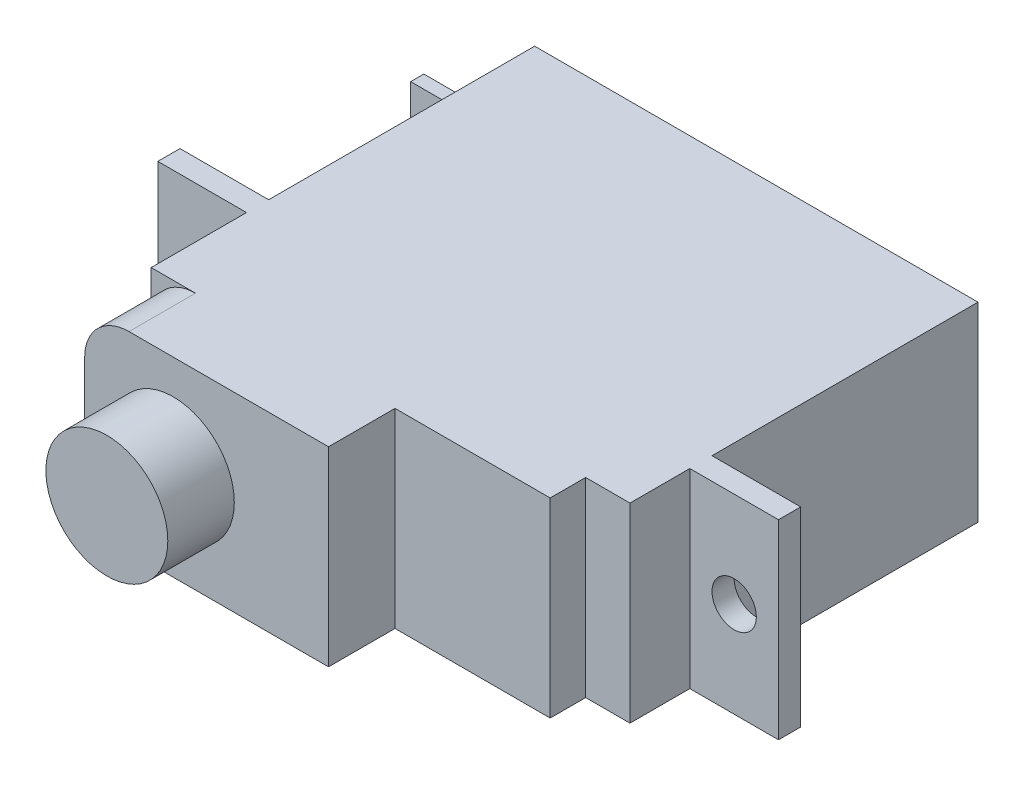
ISO-10303-21;
HEADER;
FILE_DESCRIPTION(('STEP AP214'),'2;1');
FILE_NAME('part.step','',(''),(''),'','','');
FILE_SCHEMA(('AUTOMOTIVE_DESIGN { 1 0 10303 214 1 1 1 1 }'));
ENDSEC;
DATA;
#1=APPLICATION_CONTEXT('core data for automotive mechanical design processes');
#2=APPLICATION_PROTOCOL_DEFINITION('international standard','automotive_design',2000,#1);
#3=PRODUCT_CONTEXT('',#1,'mechanical');
#4=PRODUCT('Part','Part','',(#3));
#5=PRODUCT_RELATED_PRODUCT_CATEGORY('part','',(#4));
#6=PRODUCT_DEFINITION_FORMATION('','',#4);
#7=PRODUCT_DEFINITION_CONTEXT('part definition',#1,'design');
#8=PRODUCT_DEFINITION('design','',#6,#7);
#9=PRODUCT_DEFINITION_SHAPE('','',#8);
#10=(LENGTH_UNIT() NAMED_UNIT(*) SI_UNIT(.MILLI.,.METRE.));
#11=(NAMED_UNIT(*) PLANE_ANGLE_UNIT() SI_UNIT($,.RADIAN.));
#12=(NAMED_UNIT(*) SI_UNIT($,.STERADIAN.) SOLID_ANGLE_UNIT());
#13=UNCERTAINTY_MEASURE_WITH_UNIT(LENGTH_MEASURE(1.E-05),#10,'distance_accuracy_value','');
#14=(GEOMETRIC_REPRESENTATION_CONTEXT(3) GLOBAL_UNCERTAINTY_ASSIGNED_CONTEXT((#13)) GLOBAL_UNIT_ASSIGNED_CONTEXT((#10,
#11,#12)) REPRESENTATION_CONTEXT('',''));
#15=CARTESIAN_POINT('',(0.,0.,0.));
#16=DIRECTION('',(0.,0.,1.));
#17=DIRECTION('',(1.,0.,0.));
#18=AXIS2_PLACEMENT_3D('',#15,#16,#17);
#19=CARTESIAN_POINT('',(-10.,4.3,12.));
#20=DIRECTION('',(1.,0.,0.));
#21=DIRECTION('',(0.,1.,0.));
#22=AXIS2_PLACEMENT_3D('',#19,#20,#21);
#23=PLANE('',#22);
#24=DIRECTION('',(0.,0.,1.));
#25=VECTOR('',#24,1.);
#26=CARTESIAN_POINT('',(-10.,-1.48782817677585,0.593912784888743));
#27=LINE('',#26,#25);
#28=CARTESIAN_POINT('',(-10.,-1.48782817677585,0.));
#29=VERTEX_POINT('',#28);
#30=CARTESIAN_POINT('',(-10.,-1.48782817677585,0.593912784888743));
#31=VERTEX_POINT('',#30);
#32=EDGE_CURVE('E394',#29,#31,#27,.T.);
#33=ORIENTED_EDGE('',*,*,#32,.F.);
#34=DIRECTION('',(0.,-1.,0.));
#35=VECTOR('',#34,1.);
#36=CARTESIAN_POINT('',(-10.,4.3,0.));
#37=LINE('',#36,#35);
#38=CARTESIAN_POINT('',(-10.,-4.3,0.));
#39=VERTEX_POINT('',#38);
#40=EDGE_CURVE('E217',#29,#39,#37,.T.);
#41=ORIENTED_EDGE('',*,*,#40,.T.);
#42=DIRECTION('',(0.,0.,-1.));
#43=VECTOR('',#42,1.);
#44=CARTESIAN_POINT('',(-10.,-4.3,12.));
#45=LINE('',#44,#43);
#46=CARTESIAN_POINT('',(-10.,-4.3,12.));
#47=VERTEX_POINT('',#46);
#48=EDGE_CURVE('E377',#47,#39,#45,.T.);
#49=ORIENTED_EDGE('',*,*,#48,.F.);
#50=DIRECTION('',(0.,-1.,0.));
#51=VECTOR('',#50,1.);
#52=CARTESIAN_POINT('',(-10.,4.3,12.));
#53=LINE('',#52,#51);
#54=CARTESIAN_POINT('',(-10.,4.3,12.));
#55=VERTEX_POINT('',#54);
#56=EDGE_CURVE('E363',#55,#47,#53,.T.);
#57=ORIENTED_EDGE('',*,*,#56,.F.);
#58=DIRECTION('',(0.,0.,-1.));
#59=VECTOR('',#58,1.);
#60=CARTESIAN_POINT('',(-10.,4.3,12.));
#61=LINE('',#60,#59);
#62=CARTESIAN_POINT('',(-10.,4.3,0.));
#63=VERTEX_POINT('',#62);
#64=EDGE_CURVE('E379',#55,#63,#61,.T.);
#65=ORIENTED_EDGE('',*,*,#64,.T.);
#66=CARTESIAN_POINT('',(-10.,0.712171823224154,0.));
#67=VERTEX_POINT('',#66);
#68=EDGE_CURVE('E372',#63,#67,#37,.T.);
#69=ORIENTED_EDGE('',*,*,#68,.T.);
#70=DIRECTION('',(0.,0.,-1.));
#71=VECTOR('',#70,1.);
#72=CARTESIAN_POINT('',(-10.,0.712171823224153,0.593912784888743));
#73=LINE('',#72,#71);
#74=CARTESIAN_POINT('',(-10.,0.712171823224153,0.593912784888745));
#75=VERTEX_POINT('',#74);
#76=EDGE_CURVE('E54',#75,#67,#73,.T.);
#77=ORIENTED_EDGE('',*,*,#76,.F.);
#78=DIRECTION('',(0.,1.,0.));
#79=VECTOR('',#78,1.);
#80=CARTESIAN_POINT('',(-10.,0.712171823224153,0.593912784888743));
#81=LINE('',#80,#79);
#82=EDGE_CURVE('E49',#31,#75,#81,.T.);
#83=ORIENTED_EDGE('',*,*,#82,.F.);
#84=EDGE_LOOP('',(#33,#41,#49,#57,#65,#69,#77,#83));
#85=FACE_BOUND('',#84,.T.);
#86=ADVANCED_FACE('F33',(#85),#23,.F.);
#87=CARTESIAN_POINT('',(0.,0.,17.3));
#88=DIRECTION('',(0.,0.,1.));
#89=DIRECTION('',(1.,0.,0.));
#90=AXIS2_PLACEMENT_3D('',#87,#88,#89);
#91=PLANE('',#90);
#92=DIRECTION('',(0.,1.,0.));
#93=VECTOR('',#92,1.);
#94=CARTESIAN_POINT('',(0.999999999999997,4.3,17.3));
#95=LINE('',#94,#93);
#96=CARTESIAN_POINT('',(0.999999999999997,-4.3,17.3));
#97=VERTEX_POINT('',#96);
#98=CARTESIAN_POINT('',(0.999999999999997,4.3,17.3));
#99=VERTEX_POINT('',#98);
#100=EDGE_CURVE('E221',#97,#99,#95,.T.);
#101=ORIENTED_EDGE('',*,*,#100,.F.);
#102=DIRECTION('',(1.,0.,0.));
#103=VECTOR('',#102,1.);
#104=CARTESIAN_POINT('',(-10.,-4.3,17.3));
#105=LINE('',#104,#103);
#106=CARTESIAN_POINT('',(8.,-4.3,17.3));
#107=VERTEX_POINT('',#106);
#108=EDGE_CURVE('E269',#97,#107,#105,.T.);
#109=ORIENTED_EDGE('',*,*,#108,.T.);
#110=DIRECTION('',(0.,1.,0.));
#111=VECTOR('',#110,1.);
#112=CARTESIAN_POINT('',(8.,4.3,17.3));
#113=LINE('',#112,#111);
#114=CARTESIAN_POINT('',(8.,4.3,17.3));
#115=VERTEX_POINT('',#114);
#116=EDGE_CURVE('E273',#107,#115,#113,.T.);
#117=ORIENTED_EDGE('',*,*,#116,.T.);
#118=DIRECTION('',(-1.,0.,0.));
#119=VECTOR('',#118,1.);
#120=CARTESIAN_POINT('',(-10.,4.3,17.3));
#121=LINE('',#120,#119);
#122=EDGE_CURVE('E276',#115,#99,#121,.T.);
#123=ORIENTED_EDGE('',*,*,#122,.T.);
#124=EDGE_LOOP('',(#101,#109,#117,#123));
#125=FACE_BOUND('',#124,.T.);
#126=ADVANCED_FACE('F412',(#125),#91,.T.);
#127=CARTESIAN_POINT('',(-8.,-2.3,17.3));
#128=DIRECTION('',(0.,0.,1.));
#129=DIRECTION('',(1.,0.,0.));
#130=AXIS2_PLACEMENT_3D('',#127,#128,#129);
#131=CIRCLE('',#130,2.);
#132=CARTESIAN_POINT('',(-10.,-2.3,17.3));
#133=VERTEX_POINT('',#132);
#134=CARTESIAN_POINT('',(-8.,-4.3,17.3));
#135=VERTEX_POINT('',#134);
#136=EDGE_CURVE('E231',#133,#135,#131,.T.);
#137=ORIENTED_EDGE('',*,*,#136,.F.);
#138=DIRECTION('',(0.,-1.,0.));
#139=VECTOR('',#138,1.);
#140=CARTESIAN_POINT('',(-10.,4.3,17.3));
#141=LINE('',#140,#139);
#142=CARTESIAN_POINT('',(-10.,-4.3,17.3));
#143=VERTEX_POINT('',#142);
#144=EDGE_CURVE('E270',#133,#143,#141,.T.);
#145=ORIENTED_EDGE('',*,*,#144,.T.);
#146=EDGE_CURVE('E271',#143,#135,#105,.T.);
#147=ORIENTED_EDGE('',*,*,#146,.T.);
#148=EDGE_LOOP('',(#137,#145,#147));
#149=FACE_BOUND('',#148,.T.);
#150=ADVANCED_FACE('F417',(#149),#91,.T.);
#151=CARTESIAN_POINT('',(0.,0.,13.));
#152=DIRECTION('',(0.,0.,1.));
#153=DIRECTION('',(1.,0.,0.));
#154=AXIS2_PLACEMENT_3D('',#151,#152,#153);
#155=PLANE('',#154);
#156=DIRECTION('',(0.,1.,0.));
#157=VECTOR('',#156,1.);
#158=CARTESIAN_POINT('',(10.,4.3,13.));
#159=LINE('',#158,#157);
#160=CARTESIAN_POINT('',(10.,-4.3,13.));
#161=VERTEX_POINT('',#160);
#162=CARTESIAN_POINT('',(10.,4.3,13.));
#163=VERTEX_POINT('',#162);
#164=EDGE_CURVE('E286',#161,#163,#159,.T.);
#165=ORIENTED_EDGE('',*,*,#164,.F.);
#166=DIRECTION('',(1.,0.,0.));
#167=VECTOR('',#166,1.);
#168=CARTESIAN_POINT('',(-14.,-4.3,13.));
#169=LINE('',#168,#167);
#170=CARTESIAN_POINT('',(14.,-4.3,13.));
#171=VERTEX_POINT('',#170);
#172=EDGE_CURVE('E333',#161,#171,#169,.T.);
#173=ORIENTED_EDGE('',*,*,#172,.T.);
#174=DIRECTION('',(0.,1.,0.));
#175=VECTOR('',#174,1.);
#176=CARTESIAN_POINT('',(14.,4.3,13.));
#177=LINE('',#176,#175);
#178=CARTESIAN_POINT('',(14.,4.3,13.));
#179=VERTEX_POINT('',#178);
#180=EDGE_CURVE('E324',#171,#179,#177,.T.);
#181=ORIENTED_EDGE('',*,*,#180,.T.);
#182=DIRECTION('',(-1.,0.,0.));
#183=VECTOR('',#182,1.);
#184=CARTESIAN_POINT('',(-14.,4.3,13.));
#185=LINE('',#184,#183);
#186=EDGE_CURVE('E329',#179,#163,#185,.T.);
#187=ORIENTED_EDGE('',*,*,#186,.T.);
#188=EDGE_LOOP('',(#165,#173,#181,#187));
#189=FACE_BOUND('',#188,.T.);
#190=CARTESIAN_POINT('',(12.,0.,13.));
#191=DIRECTION('',(0.,0.,1.));
#192=DIRECTION('',(1.,0.,0.));
#193=AXIS2_PLACEMENT_3D('',#190,#191,#192);
#194=CIRCLE('',#193,1.);
#195=CARTESIAN_POINT('',(13.,0.,13.));
#196=VERTEX_POINT('',#195);
#197=EDGE_CURVE('E318',#196,#196,#194,.T.);
#198=ORIENTED_EDGE('',*,*,#197,.F.);
#199=EDGE_LOOP('',(#198));
#200=FACE_BOUND('',#199,.T.);
#201=ADVANCED_FACE('F430',(#189,#200),#155,.T.);
#202=CARTESIAN_POINT('',(10.,4.3,12.));
#203=DIRECTION('',(-1.,0.,0.));
#204=DIRECTION('',(0.,0.,1.));
#205=AXIS2_PLACEMENT_3D('',#202,#203,#204);
#206=PLANE('',#205);
#207=DIRECTION('',(0.,1.,0.));
#208=VECTOR('',#207,1.);
#209=CARTESIAN_POINT('',(10.,4.3,0.));
#210=LINE('',#209,#208);
#211=CARTESIAN_POINT('',(10.,-4.3,0.));
#212=VERTEX_POINT('',#211);
#213=CARTESIAN_POINT('',(10.,4.3,0.));
#214=VERTEX_POINT('',#213);
#215=EDGE_CURVE('E359',#212,#214,#210,.T.);
#216=ORIENTED_EDGE('',*,*,#215,.T.);
#217=DIRECTION('',(0.,0.,-1.));
#218=VECTOR('',#217,1.);
#219=CARTESIAN_POINT('',(10.,4.3,12.));
#220=LINE('',#219,#218);
#221=CARTESIAN_POINT('',(10.,4.3,12.));
#222=VERTEX_POINT('',#221);
#223=EDGE_CURVE('E37',#222,#214,#220,.T.);
#224=ORIENTED_EDGE('',*,*,#223,.F.);
#225=DIRECTION('',(0.,1.,0.));
#226=VECTOR('',#225,1.);
#227=CARTESIAN_POINT('',(10.,4.3,12.));
#228=LINE('',#227,#226);
#229=CARTESIAN_POINT('',(10.,-4.3,12.));
#230=VERTEX_POINT('',#229);
#231=EDGE_CURVE('E360',#230,#222,#228,.T.);
#232=ORIENTED_EDGE('',*,*,#231,.F.);
#233=DIRECTION('',(0.,0.,-1.));
#234=VECTOR('',#233,1.);
#235=CARTESIAN_POINT('',(10.,-4.3,12.));
#236=LINE('',#235,#234);
#237=EDGE_CURVE('E367',#230,#212,#236,.T.);
#238=ORIENTED_EDGE('',*,*,#237,.T.);
#239=EDGE_LOOP('',(#216,#224,#232,#238));
#240=FACE_BOUND('',#239,.T.);
#241=ADVANCED_FACE('F35',(#240),#206,.F.);
#242=CARTESIAN_POINT('',(-10.,4.3,12.));
#243=DIRECTION('',(0.,-1.,0.));
#244=DIRECTION('',(0.,0.,-1.));
#245=AXIS2_PLACEMENT_3D('',#242,#243,#244);
#246=PLANE('',#245);
#247=DIRECTION('',(-1.,0.,0.));
#248=VECTOR('',#247,1.);
#249=CARTESIAN_POINT('',(-10.,4.3,0.));
#250=LINE('',#249,#248);
#251=EDGE_CURVE('E370',#214,#63,#250,.T.);
#252=ORIENTED_EDGE('',*,*,#251,.T.);
#253=ORIENTED_EDGE('',*,*,#64,.F.);
#254=DIRECTION('',(-1.,0.,0.));
#255=VECTOR('',#254,1.);
#256=CARTESIAN_POINT('',(-14.,4.3,12.));
#257=LINE('',#256,#255);
#258=CARTESIAN_POINT('',(-14.,4.3,12.));
#259=VERTEX_POINT('',#258);
#260=EDGE_CURVE('E339',#55,#259,#257,.T.);
#261=ORIENTED_EDGE('',*,*,#260,.T.);
#262=DIRECTION('',(0.,0.,-1.));
#263=VECTOR('',#262,1.);
#264=CARTESIAN_POINT('',(-14.,4.3,13.));
#265=LINE('',#264,#263);
#266=CARTESIAN_POINT('',(-14.,4.3,13.));
#267=VERTEX_POINT('',#266);
#268=EDGE_CURVE('E353',#267,#259,#265,.T.);
#269=ORIENTED_EDGE('',*,*,#268,.F.);
#270=CARTESIAN_POINT('',(-10.,4.3,13.));
#271=VERTEX_POINT('',#270);
#272=EDGE_CURVE('E327',#271,#267,#185,.T.);
#273=ORIENTED_EDGE('',*,*,#272,.F.);
#274=DIRECTION('',(0.,0.,-1.));
#275=VECTOR('',#274,1.);
#276=CARTESIAN_POINT('',(-10.,4.3,15.7));
#277=LINE('',#276,#275);
#278=CARTESIAN_POINT('',(-10.,4.3,17.3));
#279=VERTEX_POINT('',#278);
#280=EDGE_CURVE('E305',#279,#271,#277,.T.);
#281=ORIENTED_EDGE('',*,*,#280,.F.);
#282=CARTESIAN_POINT('',(-8.,4.3,17.3));
#283=VERTEX_POINT('',#282);
#284=EDGE_CURVE('E275',#283,#279,#121,.T.);
#285=ORIENTED_EDGE('',*,*,#284,.F.);
#286=DIRECTION('',(0.,0.,-1.));
#287=VECTOR('',#286,1.);
#288=CARTESIAN_POINT('',(-7.99999999999999,4.3,20.3));
#289=LINE('',#288,#287);
#290=CARTESIAN_POINT('',(-7.99999999999999,4.3,20.3));
#291=VERTEX_POINT('',#290);
#292=EDGE_CURVE('E260',#291,#283,#289,.T.);
#293=ORIENTED_EDGE('',*,*,#292,.F.);
#294=DIRECTION('',(-1.,0.,0.));
#295=VECTOR('',#294,1.);
#296=CARTESIAN_POINT('',(-7.99999999999999,4.3,20.3));
#297=LINE('',#296,#295);
#298=CARTESIAN_POINT('',(0.999999999999997,4.3,20.3));
#299=VERTEX_POINT('',#298);
#300=EDGE_CURVE('E230',#299,#291,#297,.T.);
#301=ORIENTED_EDGE('',*,*,#300,.F.);
#302=DIRECTION('',(0.,0.,-1.));
#303=VECTOR('',#302,1.);
#304=CARTESIAN_POINT('',(0.999999999999997,4.3,20.3));
#305=LINE('',#304,#303);
#306=EDGE_CURVE('E263',#299,#99,#305,.T.);
#307=ORIENTED_EDGE('',*,*,#306,.T.);
#308=ORIENTED_EDGE('',*,*,#122,.F.);
#309=DIRECTION('',(0.,0.,-1.));
#310=VECTOR('',#309,1.);
#311=CARTESIAN_POINT('',(8.,4.3,17.3));
#312=LINE('',#311,#310);
#313=CARTESIAN_POINT('',(8.,4.3,15.7));
#314=VERTEX_POINT('',#313);
#315=EDGE_CURVE('E278',#115,#314,#312,.T.);
#316=ORIENTED_EDGE('',*,*,#315,.T.);
#317=DIRECTION('',(-1.,0.,0.));
#318=VECTOR('',#317,1.);
#319=CARTESIAN_POINT('',(-10.,4.3,15.7));
#320=LINE('',#319,#318);
#321=CARTESIAN_POINT('',(10.,4.3,15.7));
#322=VERTEX_POINT('',#321);
#323=EDGE_CURVE('E290',#322,#314,#320,.T.);
#324=ORIENTED_EDGE('',*,*,#323,.F.);
#325=DIRECTION('',(0.,0.,-1.));
#326=VECTOR('',#325,1.);
#327=CARTESIAN_POINT('',(10.,4.3,15.7));
#328=LINE('',#327,#326);
#329=EDGE_CURVE('E308',#322,#163,#328,.T.);
#330=ORIENTED_EDGE('',*,*,#329,.T.);
#331=ORIENTED_EDGE('',*,*,#186,.F.);
#332=DIRECTION('',(0.,0.,-1.));
#333=VECTOR('',#332,1.);
#334=CARTESIAN_POINT('',(14.,4.3,13.));
#335=LINE('',#334,#333);
#336=CARTESIAN_POINT('',(14.,4.3,12.));
#337=VERTEX_POINT('',#336);
#338=EDGE_CURVE('E356',#179,#337,#335,.T.);
#339=ORIENTED_EDGE('',*,*,#338,.T.);
#340=EDGE_CURVE('E340',#337,#222,#257,.T.);
#341=ORIENTED_EDGE('',*,*,#340,.T.);
#342=ORIENTED_EDGE('',*,*,#223,.T.);
#343=EDGE_LOOP('',(#252,#253,#261,#269,#273,#281,#285,#293,#301,#307,#308,#316,#324,#330,#331,
#339,#341,#342));
#344=FACE_BOUND('',#343,.T.);
#345=ADVANCED_FACE('F385',(#344),#246,.F.);
#346=CARTESIAN_POINT('',(-10.,-4.3,12.));
#347=DIRECTION('',(0.,1.,0.));
#348=DIRECTION('',(0.,0.,1.));
#349=AXIS2_PLACEMENT_3D('',#346,#347,#348);
#350=PLANE('',#349);
#351=DIRECTION('',(1.,0.,0.));
#352=VECTOR('',#351,1.);
#353=CARTESIAN_POINT('',(-10.,-4.3,0.));
#354=LINE('',#353,#352);
#355=EDGE_CURVE('E364',#39,#212,#354,.T.);
#356=ORIENTED_EDGE('',*,*,#355,.T.);
#357=ORIENTED_EDGE('',*,*,#237,.F.);
#358=DIRECTION('',(1.,0.,0.));
#359=VECTOR('',#358,1.);
#360=CARTESIAN_POINT('',(-14.,-4.3,12.));
#361=LINE('',#360,#359);
#362=CARTESIAN_POINT('',(14.,-4.3,12.));
#363=VERTEX_POINT('',#362);
#364=EDGE_CURVE('E345',#230,#363,#361,.T.);
#365=ORIENTED_EDGE('',*,*,#364,.T.);
#366=DIRECTION('',(0.,0.,-1.));
#367=VECTOR('',#366,1.);
#368=CARTESIAN_POINT('',(14.,-4.3,13.));
#369=LINE('',#368,#367);
#370=EDGE_CURVE('E336',#171,#363,#369,.T.);
#371=ORIENTED_EDGE('',*,*,#370,.F.);
#372=ORIENTED_EDGE('',*,*,#172,.F.);
#373=DIRECTION('',(0.,0.,-1.));
#374=VECTOR('',#373,1.);
#375=CARTESIAN_POINT('',(10.,-4.3,15.7));
#376=LINE('',#375,#374);
#377=CARTESIAN_POINT('',(10.,-4.3,15.7));
#378=VERTEX_POINT('',#377);
#379=EDGE_CURVE('E295',#378,#161,#376,.T.);
#380=ORIENTED_EDGE('',*,*,#379,.F.);
#381=DIRECTION('',(1.,0.,0.));
#382=VECTOR('',#381,1.);
#383=CARTESIAN_POINT('',(-10.,-4.3,15.7));
#384=LINE('',#383,#382);
#385=CARTESIAN_POINT('',(8.,-4.3,15.7));
#386=VERTEX_POINT('',#385);
#387=EDGE_CURVE('E293',#386,#378,#384,.T.);
#388=ORIENTED_EDGE('',*,*,#387,.F.);
#389=DIRECTION('',(0.,0.,-1.));
#390=VECTOR('',#389,1.);
#391=CARTESIAN_POINT('',(8.,-4.3,17.3));
#392=LINE('',#391,#390);
#393=EDGE_CURVE('E283',#107,#386,#392,.T.);
#394=ORIENTED_EDGE('',*,*,#393,.F.);
#395=ORIENTED_EDGE('',*,*,#108,.F.);
#396=DIRECTION('',(0.,0.,-1.));
#397=VECTOR('',#396,1.);
#398=CARTESIAN_POINT('',(0.999999999999999,-4.3,20.3));
#399=LINE('',#398,#397);
#400=CARTESIAN_POINT('',(0.999999999999999,-4.3,20.3));
#401=VERTEX_POINT('',#400);
#402=EDGE_CURVE('E241',#401,#97,#399,.T.);
#403=ORIENTED_EDGE('',*,*,#402,.F.);
#404=DIRECTION('',(1.,0.,0.));
#405=VECTOR('',#404,1.);
#406=CARTESIAN_POINT('',(-7.99999999999999,-4.3,20.3));
#407=LINE('',#406,#405);
#408=CARTESIAN_POINT('',(-7.99999999999999,-4.3,20.3));
#409=VERTEX_POINT('',#408);
#410=EDGE_CURVE('E239',#409,#401,#407,.T.);
#411=ORIENTED_EDGE('',*,*,#410,.F.);
#412=DIRECTION('',(0.,0.,-1.));
#413=VECTOR('',#412,1.);
#414=CARTESIAN_POINT('',(-7.99999999999999,-4.3,20.3));
#415=LINE('',#414,#413);
#416=EDGE_CURVE('E251',#409,#135,#415,.T.);
#417=ORIENTED_EDGE('',*,*,#416,.T.);
#418=ORIENTED_EDGE('',*,*,#146,.F.);
#419=DIRECTION('',(0.,0.,-1.));
#420=VECTOR('',#419,1.);
#421=CARTESIAN_POINT('',(-10.,-4.3,15.7));
#422=LINE('',#421,#420);
#423=CARTESIAN_POINT('',(-10.,-4.3,13.));
#424=VERTEX_POINT('',#423);
#425=EDGE_CURVE('E302',#143,#424,#422,.T.);
#426=ORIENTED_EDGE('',*,*,#425,.T.);
#427=CARTESIAN_POINT('',(-14.,-4.3,13.));
#428=VERTEX_POINT('',#427);
#429=EDGE_CURVE('E334',#428,#424,#169,.T.);
#430=ORIENTED_EDGE('',*,*,#429,.F.);
#431=DIRECTION('',(0.,0.,-1.));
#432=VECTOR('',#431,1.);
#433=CARTESIAN_POINT('',(-14.,-4.3,13.));
#434=LINE('',#433,#432);
#435=CARTESIAN_POINT('',(-14.,-4.3,12.));
#436=VERTEX_POINT('',#435);
#437=EDGE_CURVE('E350',#428,#436,#434,.T.);
#438=ORIENTED_EDGE('',*,*,#437,.T.);
#439=EDGE_CURVE('E328',#436,#47,#361,.T.);
#440=ORIENTED_EDGE('',*,*,#439,.T.);
#441=ORIENTED_EDGE('',*,*,#48,.T.);
#442=EDGE_LOOP('',(#356,#357,#365,#371,#372,#380,#388,#394,#395,#403,#411,#417,#418,#426,#430,
#438,#440,#441));
#443=FACE_BOUND('',#442,.T.);
#444=ADVANCED_FACE('F422',(#443),#350,.F.);
#445=CARTESIAN_POINT('',(0.,0.,0.));
#446=DIRECTION('',(0.,0.,1.));
#447=DIRECTION('',(1.,0.,0.));
#448=AXIS2_PLACEMENT_3D('',#445,#446,#447);
#449=PLANE('',#448);
#450=ORIENTED_EDGE('',*,*,#215,.F.);
#451=ORIENTED_EDGE('',*,*,#355,.F.);
#452=ORIENTED_EDGE('',*,*,#40,.F.);
#453=DIRECTION('',(1.,0.,0.));
#454=VECTOR('',#453,1.);
#455=CARTESIAN_POINT('',(-15.,-1.48782817677585,0.));
#456=LINE('',#455,#454);
#457=CARTESIAN_POINT('',(-15.,-1.48782817677585,0.));
#458=VERTEX_POINT('',#457);
#459=EDGE_CURVE('E198',#458,#29,#456,.T.);
#460=ORIENTED_EDGE('',*,*,#459,.F.);
#461=DIRECTION('',(0.,-1.,0.));
#462=VECTOR('',#461,1.);
#463=CARTESIAN_POINT('',(-15.,0.712171823224153,0.));
#464=LINE('',#463,#462);
#465=CARTESIAN_POINT('',(-15.,0.712171823224153,0.));
#466=VERTEX_POINT('',#465);
#467=EDGE_CURVE('E204',#466,#458,#464,.T.);
#468=ORIENTED_EDGE('',*,*,#467,.F.);
#469=DIRECTION('',(1.,0.,0.));
#470=VECTOR('',#469,1.);
#471=CARTESIAN_POINT('',(-15.,0.712171823224153,0.));
#472=LINE('',#471,#470);
#473=EDGE_CURVE('E388',#466,#67,#472,.T.);
#474=ORIENTED_EDGE('',*,*,#473,.T.);
#475=ORIENTED_EDGE('',*,*,#68,.F.);
#476=ORIENTED_EDGE('',*,*,#251,.F.);
#477=EDGE_LOOP('',(#450,#451,#452,#460,#468,#474,#475,#476));
#478=FACE_BOUND('',#477,.T.);
#479=ADVANCED_FACE('F215',(#478),#449,.F.);
#480=CARTESIAN_POINT('',(0.,0.,12.));
#481=DIRECTION('',(0.,0.,1.));
#482=DIRECTION('',(1.,0.,0.));
#483=AXIS2_PLACEMENT_3D('',#480,#481,#482);
#484=PLANE('',#483);
#485=CARTESIAN_POINT('',(12.,0.,12.));
#486=DIRECTION('',(0.,0.,1.));
#487=DIRECTION('',(1.,0.,0.));
#488=AXIS2_PLACEMENT_3D('',#485,#486,#487);
#489=CIRCLE('',#488,1.);
#490=CARTESIAN_POINT('',(13.,0.,12.));
#491=VERTEX_POINT('',#490);
#492=EDGE_CURVE('E315',#491,#491,#489,.T.);
#493=ORIENTED_EDGE('',*,*,#492,.T.);
#494=EDGE_LOOP('',(#493));
#495=FACE_BOUND('',#494,.T.);
#496=ORIENTED_EDGE('',*,*,#364,.F.);
#497=ORIENTED_EDGE('',*,*,#231,.T.);
#498=ORIENTED_EDGE('',*,*,#340,.F.);
#499=DIRECTION('',(0.,1.,0.));
#500=VECTOR('',#499,1.);
#501=CARTESIAN_POINT('',(14.,4.3,12.));
#502=LINE('',#501,#500);
#503=EDGE_CURVE('E321',#363,#337,#502,.T.);
#504=ORIENTED_EDGE('',*,*,#503,.F.);
#505=EDGE_LOOP('',(#496,#497,#498,#504));
#506=FACE_BOUND('',#505,.T.);
#507=ADVANCED_FACE('F455',(#495,#506),#484,.F.);
#508=CARTESIAN_POINT('',(-12.,0.,12.));
#509=DIRECTION('',(0.,0.,1.));
#510=DIRECTION('',(1.,0.,0.));
#511=AXIS2_PLACEMENT_3D('',#508,#509,#510);
#512=CIRCLE('',#511,1.);
#513=CARTESIAN_POINT('',(-11.,0.,12.));
#514=VERTEX_POINT('',#513);
#515=EDGE_CURVE('E311',#514,#514,#512,.T.);
#516=ORIENTED_EDGE('',*,*,#515,.T.);
#517=EDGE_LOOP('',(#516));
#518=FACE_BOUND('',#517,.T.);
#519=ORIENTED_EDGE('',*,*,#260,.F.);
#520=ORIENTED_EDGE('',*,*,#56,.T.);
#521=ORIENTED_EDGE('',*,*,#439,.F.);
#522=DIRECTION('',(0.,-1.,0.));
#523=VECTOR('',#522,1.);
#524=CARTESIAN_POINT('',(-14.,4.3,12.));
#525=LINE('',#524,#523);
#526=EDGE_CURVE('E343',#259,#436,#525,.T.);
#527=ORIENTED_EDGE('',*,*,#526,.F.);
#528=EDGE_LOOP('',(#519,#520,#521,#527));
#529=FACE_BOUND('',#528,.T.);
#530=ADVANCED_FACE('F446',(#518,#529),#484,.F.);
#531=DIRECTION('',(0.,-1.,0.));
#532=VECTOR('',#531,1.);
#533=CARTESIAN_POINT('',(-10.,4.3,13.));
#534=LINE('',#533,#532);
#535=EDGE_CURVE('E291',#271,#424,#534,.T.);
#536=ORIENTED_EDGE('',*,*,#535,.F.);
#537=ORIENTED_EDGE('',*,*,#272,.T.);
#538=DIRECTION('',(0.,-1.,0.));
#539=VECTOR('',#538,1.);
#540=CARTESIAN_POINT('',(-14.,4.3,13.));
#541=LINE('',#540,#539);
#542=EDGE_CURVE('E331',#267,#428,#541,.T.);
#543=ORIENTED_EDGE('',*,*,#542,.T.);
#544=ORIENTED_EDGE('',*,*,#429,.T.);
#545=EDGE_LOOP('',(#536,#537,#543,#544));
#546=FACE_BOUND('',#545,.T.);
#547=CARTESIAN_POINT('',(-12.,0.,13.));
#548=DIRECTION('',(0.,0.,1.));
#549=DIRECTION('',(1.,0.,0.));
#550=AXIS2_PLACEMENT_3D('',#547,#548,#549);
#551=CIRCLE('',#550,1.);
#552=CARTESIAN_POINT('',(-11.,0.,13.));
#553=VERTEX_POINT('',#552);
#554=EDGE_CURVE('E312',#553,#553,#551,.T.);
#555=ORIENTED_EDGE('',*,*,#554,.F.);
#556=EDGE_LOOP('',(#555));
#557=FACE_BOUND('',#556,.T.);
#558=ADVANCED_FACE('F436',(#546,#557),#155,.T.);
#559=CARTESIAN_POINT('',(14.,4.3,13.));
#560=DIRECTION('',(-1.,0.,0.));
#561=DIRECTION('',(0.,0.,1.));
#562=AXIS2_PLACEMENT_3D('',#559,#560,#561);
#563=PLANE('',#562);
#564=ORIENTED_EDGE('',*,*,#503,.T.);
#565=ORIENTED_EDGE('',*,*,#338,.F.);
#566=ORIENTED_EDGE('',*,*,#180,.F.);
#567=ORIENTED_EDGE('',*,*,#370,.T.);
#568=EDGE_LOOP('',(#564,#565,#566,#567));
#569=FACE_BOUND('',#568,.T.);
#570=ADVANCED_FACE('F445',(#569),#563,.F.);
#571=CARTESIAN_POINT('',(-14.,4.3,13.));
#572=DIRECTION('',(1.,0.,0.));
#573=DIRECTION('',(0.,0.,-1.));
#574=AXIS2_PLACEMENT_3D('',#571,#572,#573);
#575=PLANE('',#574);
#576=ORIENTED_EDGE('',*,*,#526,.T.);
#577=ORIENTED_EDGE('',*,*,#437,.F.);
#578=ORIENTED_EDGE('',*,*,#542,.F.);
#579=ORIENTED_EDGE('',*,*,#268,.T.);
#580=EDGE_LOOP('',(#576,#577,#578,#579));
#581=FACE_BOUND('',#580,.T.);
#582=ADVANCED_FACE('F452',(#581),#575,.F.);
#583=CARTESIAN_POINT('',(12.,0.,13.));
#584=DIRECTION('',(0.,0.,-1.));
#585=DIRECTION('',(-1.,0.,0.));
#586=AXIS2_PLACEMENT_3D('',#583,#584,#585);
#587=CYLINDRICAL_SURFACE('',#586,1.);
#588=ORIENTED_EDGE('',*,*,#197,.T.);
#589=EDGE_LOOP('',(#588));
#590=FACE_BOUND('',#589,.T.);
#591=ORIENTED_EDGE('',*,*,#492,.F.);
#592=EDGE_LOOP('',(#591));
#593=FACE_BOUND('',#592,.T.);
#594=ADVANCED_FACE('F465',(#590,#593),#587,.F.);
#595=CARTESIAN_POINT('',(-12.,0.,13.));
#596=DIRECTION('',(0.,0.,-1.));
#597=DIRECTION('',(-1.,0.,0.));
#598=AXIS2_PLACEMENT_3D('',#595,#596,#597);
#599=CYLINDRICAL_SURFACE('',#598,1.);
#600=ORIENTED_EDGE('',*,*,#554,.T.);
#601=EDGE_LOOP('',(#600));
#602=FACE_BOUND('',#601,.T.);
#603=ORIENTED_EDGE('',*,*,#515,.F.);
#604=EDGE_LOOP('',(#603));
#605=FACE_BOUND('',#604,.T.);
#606=ADVANCED_FACE('F461',(#602,#605),#599,.F.);
#607=CARTESIAN_POINT('',(10.,4.3,15.7));
#608=DIRECTION('',(-1.,0.,0.));
#609=DIRECTION('',(0.,0.,1.));
#610=AXIS2_PLACEMENT_3D('',#607,#608,#609);
#611=PLANE('',#610);
#612=ORIENTED_EDGE('',*,*,#164,.T.);
#613=ORIENTED_EDGE('',*,*,#329,.F.);
#614=DIRECTION('',(0.,1.,0.));
#615=VECTOR('',#614,1.);
#616=CARTESIAN_POINT('',(10.,4.3,15.7));
#617=LINE('',#616,#615);
#618=EDGE_CURVE('E287',#378,#322,#617,.T.);
#619=ORIENTED_EDGE('',*,*,#618,.F.);
#620=ORIENTED_EDGE('',*,*,#379,.T.);
#621=EDGE_LOOP('',(#612,#613,#619,#620));
#622=FACE_BOUND('',#621,.T.);
#623=ADVANCED_FACE('F464',(#622),#611,.F.);
#624=CARTESIAN_POINT('',(-10.,4.3,15.7));
#625=DIRECTION('',(1.,0.,0.));
#626=DIRECTION('',(0.,0.,-1.));
#627=AXIS2_PLACEMENT_3D('',#624,#625,#626);
#628=PLANE('',#627);
#629=ORIENTED_EDGE('',*,*,#535,.T.);
#630=ORIENTED_EDGE('',*,*,#425,.F.);
#631=ORIENTED_EDGE('',*,*,#144,.F.);
#632=DIRECTION('',(0.,0.,-1.));
#633=VECTOR('',#632,1.);
#634=CARTESIAN_POINT('',(-10.,-2.29999999999998,20.3));
#635=LINE('',#634,#633);
#636=CARTESIAN_POINT('',(-10.,-2.29999999999998,20.3));
#637=VERTEX_POINT('',#636);
#638=EDGE_CURVE('E254',#637,#133,#635,.T.);
#639=ORIENTED_EDGE('',*,*,#638,.F.);
#640=DIRECTION('',(0.,-1.,0.));
#641=VECTOR('',#640,1.);
#642=CARTESIAN_POINT('',(-10.,2.29999999999998,20.3));
#643=LINE('',#642,#641);
#644=CARTESIAN_POINT('',(-10.,2.29999999999998,20.3));
#645=VERTEX_POINT('',#644);
#646=EDGE_CURVE('E235',#645,#637,#643,.T.);
#647=ORIENTED_EDGE('',*,*,#646,.F.);
#648=DIRECTION('',(0.,0.,-1.));
#649=VECTOR('',#648,1.);
#650=CARTESIAN_POINT('',(-10.,2.29999999999998,20.3));
#651=LINE('',#650,#649);
#652=CARTESIAN_POINT('',(-10.,2.29999999999998,17.3));
#653=VERTEX_POINT('',#652);
#654=EDGE_CURVE('E257',#645,#653,#651,.T.);
#655=ORIENTED_EDGE('',*,*,#654,.T.);
#656=EDGE_CURVE('E267',#279,#653,#141,.T.);
#657=ORIENTED_EDGE('',*,*,#656,.F.);
#658=ORIENTED_EDGE('',*,*,#280,.T.);
#659=EDGE_LOOP('',(#629,#630,#631,#639,#647,#655,#657,#658));
#660=FACE_BOUND('',#659,.T.);
#661=ADVANCED_FACE('F481',(#660),#628,.F.);
#662=CARTESIAN_POINT('',(0.,0.,15.7));
#663=DIRECTION('',(0.,0.,1.));
#664=DIRECTION('',(1.,0.,0.));
#665=AXIS2_PLACEMENT_3D('',#662,#663,#664);
#666=PLANE('',#665);
#667=DIRECTION('',(0.,1.,0.));
#668=VECTOR('',#667,1.);
#669=CARTESIAN_POINT('',(8.,4.3,15.7));
#670=LINE('',#669,#668);
#671=EDGE_CURVE('E266',#386,#314,#670,.T.);
#672=ORIENTED_EDGE('',*,*,#671,.F.);
#673=ORIENTED_EDGE('',*,*,#387,.T.);
#674=ORIENTED_EDGE('',*,*,#618,.T.);
#675=ORIENTED_EDGE('',*,*,#323,.T.);
#676=EDGE_LOOP('',(#672,#673,#674,#675));
#677=FACE_BOUND('',#676,.T.);
#678=ADVANCED_FACE('F510',(#677),#666,.T.);
#679=CARTESIAN_POINT('',(8.,4.3,17.3));
#680=DIRECTION('',(-1.,0.,0.));
#681=DIRECTION('',(0.,-1.,0.));
#682=AXIS2_PLACEMENT_3D('',#679,#680,#681);
#683=PLANE('',#682);
#684=ORIENTED_EDGE('',*,*,#671,.T.);
#685=ORIENTED_EDGE('',*,*,#315,.F.);
#686=ORIENTED_EDGE('',*,*,#116,.F.);
#687=ORIENTED_EDGE('',*,*,#393,.T.);
#688=EDGE_LOOP('',(#684,#685,#686,#687));
#689=FACE_BOUND('',#688,.T.);
#690=ADVANCED_FACE('F506',(#689),#683,.F.);
#691=CARTESIAN_POINT('',(-8.,2.3,17.3));
#692=DIRECTION('',(0.,0.,1.));
#693=DIRECTION('',(1.,0.,0.));
#694=AXIS2_PLACEMENT_3D('',#691,#692,#693);
#695=CIRCLE('',#694,2.);
#696=EDGE_CURVE('E244',#283,#653,#695,.T.);
#697=ORIENTED_EDGE('',*,*,#696,.F.);
#698=ORIENTED_EDGE('',*,*,#284,.T.);
#699=ORIENTED_EDGE('',*,*,#656,.T.);
#700=EDGE_LOOP('',(#697,#698,#699));
#701=FACE_BOUND('',#700,.T.);
#702=ADVANCED_FACE('F420',(#701),#91,.T.);
#703=CARTESIAN_POINT('',(0.999999999999997,4.3,20.3));
#704=DIRECTION('',(-1.,0.,0.));
#705=DIRECTION('',(0.,-1.,0.));
#706=AXIS2_PLACEMENT_3D('',#703,#704,#705);
#707=PLANE('',#706);
#708=ORIENTED_EDGE('',*,*,#100,.T.);
#709=ORIENTED_EDGE('',*,*,#306,.F.);
#710=DIRECTION('',(0.,1.,0.));
#711=VECTOR('',#710,1.);
#712=CARTESIAN_POINT('',(0.999999999999997,4.3,20.3));
#713=LINE('',#712,#711);
#714=EDGE_CURVE('E227',#401,#299,#713,.T.);
#715=ORIENTED_EDGE('',*,*,#714,.F.);
#716=ORIENTED_EDGE('',*,*,#402,.T.);
#717=EDGE_LOOP('',(#708,#709,#715,#716));
#718=FACE_BOUND('',#717,.T.);
#719=ADVANCED_FACE('F498',(#718),#707,.F.);
#720=CARTESIAN_POINT('',(-8.,2.3,20.3));
#721=DIRECTION('',(0.,0.,-1.));
#722=DIRECTION('',(-1.,0.,0.));
#723=AXIS2_PLACEMENT_3D('',#720,#721,#722);
#724=CYLINDRICAL_SURFACE('',#723,2.);
#725=ORIENTED_EDGE('',*,*,#696,.T.);
#726=ORIENTED_EDGE('',*,*,#654,.F.);
#727=CARTESIAN_POINT('',(-8.,2.3,20.3));
#728=DIRECTION('',(0.,0.,1.));
#729=DIRECTION('',(1.,0.,0.));
#730=AXIS2_PLACEMENT_3D('',#727,#728,#729);
#731=CIRCLE('',#730,2.);
#732=EDGE_CURVE('E233',#291,#645,#731,.T.);
#733=ORIENTED_EDGE('',*,*,#732,.F.);
#734=ORIENTED_EDGE('',*,*,#292,.T.);
#735=EDGE_LOOP('',(#725,#726,#733,#734));
#736=FACE_BOUND('',#735,.T.);
#737=ADVANCED_FACE('F487',(#736),#724,.T.);
#738=CARTESIAN_POINT('',(-8.,-2.3,20.3));
#739=DIRECTION('',(0.,0.,-1.));
#740=DIRECTION('',(-1.,0.,0.));
#741=AXIS2_PLACEMENT_3D('',#738,#739,#740);
#742=CYLINDRICAL_SURFACE('',#741,2.);
#743=ORIENTED_EDGE('',*,*,#136,.T.);
#744=ORIENTED_EDGE('',*,*,#416,.F.);
#745=CARTESIAN_POINT('',(-8.,-2.3,20.3));
#746=DIRECTION('',(0.,0.,1.));
#747=DIRECTION('',(1.,0.,0.));
#748=AXIS2_PLACEMENT_3D('',#745,#746,#747);
#749=CIRCLE('',#748,2.);
#750=EDGE_CURVE('E237',#637,#409,#749,.T.);
#751=ORIENTED_EDGE('',*,*,#750,.F.);
#752=ORIENTED_EDGE('',*,*,#638,.T.);
#753=EDGE_LOOP('',(#743,#744,#751,#752));
#754=FACE_BOUND('',#753,.T.);
#755=ADVANCED_FACE('F547',(#754),#742,.T.);
#756=CARTESIAN_POINT('',(-8.,-2.3,20.3));
#757=DIRECTION('',(0.,0.,1.));
#758=DIRECTION('',(1.,0.,0.));
#759=AXIS2_PLACEMENT_3D('',#756,#757,#758);
#760=PLANE('',#759);
#761=CARTESIAN_POINT('',(-6.,0.,20.3));
#762=DIRECTION('',(0.,0.,1.));
#763=DIRECTION('',(1.,0.,0.));
#764=AXIS2_PLACEMENT_3D('',#761,#762,#763);
#765=CIRCLE('',#764,2.75);
#766=CARTESIAN_POINT('',(-3.25,0.,20.3));
#767=VERTEX_POINT('',#766);
#768=EDGE_CURVE('E11',#767,#767,#765,.T.);
#769=ORIENTED_EDGE('',*,*,#768,.F.);
#770=EDGE_LOOP('',(#769));
#771=FACE_BOUND('',#770,.T.);
#772=ORIENTED_EDGE('',*,*,#714,.T.);
#773=ORIENTED_EDGE('',*,*,#300,.T.);
#774=ORIENTED_EDGE('',*,*,#732,.T.);
#775=ORIENTED_EDGE('',*,*,#646,.T.);
#776=ORIENTED_EDGE('',*,*,#750,.T.);
#777=ORIENTED_EDGE('',*,*,#410,.T.);
#778=EDGE_LOOP('',(#772,#773,#774,#775,#776,#777));
#779=FACE_BOUND('',#778,.T.);
#780=ADVANCED_FACE('F494',(#771,#779),#760,.T.);
#781=CARTESIAN_POINT('',(-6.,0.,23.3));
#782=DIRECTION('',(0.,0.,-1.));
#783=DIRECTION('',(-1.,0.,0.));
#784=AXIS2_PLACEMENT_3D('',#781,#782,#783);
#785=CYLINDRICAL_SURFACE('',#784,2.75);
#786=CARTESIAN_POINT('',(-6.,0.,23.3));
#787=DIRECTION('',(0.,0.,1.));
#788=DIRECTION('',(1.,0.,0.));
#789=AXIS2_PLACEMENT_3D('',#786,#787,#788);
#790=CIRCLE('',#789,2.75);
#791=CARTESIAN_POINT('',(-3.25,0.,23.3));
#792=VERTEX_POINT('',#791);
#793=EDGE_CURVE('E218',#792,#792,#790,.T.);
#794=ORIENTED_EDGE('',*,*,#793,.F.);
#795=EDGE_LOOP('',(#794));
#796=FACE_BOUND('',#795,.T.);
#797=ORIENTED_EDGE('',*,*,#768,.T.);
#798=EDGE_LOOP('',(#797));
#799=FACE_BOUND('',#798,.T.);
#800=ADVANCED_FACE('F553',(#796,#799),#785,.T.);
#801=CARTESIAN_POINT('',(-6.,0.,23.3));
#802=DIRECTION('',(0.,0.,1.));
#803=DIRECTION('',(1.,0.,0.));
#804=AXIS2_PLACEMENT_3D('',#801,#802,#803);
#805=PLANE('',#804);
#806=ORIENTED_EDGE('',*,*,#793,.T.);
#807=EDGE_LOOP('',(#806));
#808=FACE_BOUND('',#807,.T.);
#809=ADVANCED_FACE('F409',(#808),#805,.T.);
#810=CARTESIAN_POINT('',(-15.,-1.48782817677585,0.593912784888743));
#811=DIRECTION('',(0.,1.,0.));
#812=DIRECTION('',(0.,0.,1.));
#813=AXIS2_PLACEMENT_3D('',#810,#811,#812);
#814=PLANE('',#813);
#815=ORIENTED_EDGE('',*,*,#32,.T.);
#816=DIRECTION('',(1.,0.,0.));
#817=VECTOR('',#816,1.);
#818=CARTESIAN_POINT('',(-15.,-1.48782817677585,0.593912784888743));
#819=LINE('',#818,#817);
#820=CARTESIAN_POINT('',(-15.,-1.48782817677585,0.593912784888743));
#821=VERTEX_POINT('',#820);
#822=EDGE_CURVE('E200',#821,#31,#819,.T.);
#823=ORIENTED_EDGE('',*,*,#822,.F.);
#824=DIRECTION('',(0.,0.,1.));
#825=VECTOR('',#824,1.);
#826=CARTESIAN_POINT('',(-15.,-1.48782817677585,0.593912784888743));
#827=LINE('',#826,#825);
#828=EDGE_CURVE('E194',#458,#821,#827,.T.);
#829=ORIENTED_EDGE('',*,*,#828,.F.);
#830=ORIENTED_EDGE('',*,*,#459,.T.);
#831=EDGE_LOOP('',(#815,#823,#829,#830));
#832=FACE_BOUND('',#831,.T.);
#833=ADVANCED_FACE('F196',(#832),#814,.F.);
#834=CARTESIAN_POINT('',(-15.,0.712171823224152,0.593912784888743));
#835=DIRECTION('',(0.,0.,-1.));
#836=DIRECTION('',(-1.,0.,0.));
#837=AXIS2_PLACEMENT_3D('',#834,#835,#836);
#838=PLANE('',#837);
#839=ORIENTED_EDGE('',*,*,#82,.T.);
#840=DIRECTION('',(1.,0.,0.));
#841=VECTOR('',#840,1.);
#842=CARTESIAN_POINT('',(-15.,0.712171823224152,0.593912784888743));
#843=LINE('',#842,#841);
#844=CARTESIAN_POINT('',(-15.,0.712171823224152,0.593912784888743));
#845=VERTEX_POINT('',#844);
#846=EDGE_CURVE('E223',#845,#75,#843,.T.);
#847=ORIENTED_EDGE('',*,*,#846,.F.);
#848=DIRECTION('',(0.,1.,0.));
#849=VECTOR('',#848,1.);
#850=CARTESIAN_POINT('',(-15.,0.712171823224152,0.593912784888743));
#851=LINE('',#850,#849);
#852=EDGE_CURVE('E203',#821,#845,#851,.T.);
#853=ORIENTED_EDGE('',*,*,#852,.F.);
#854=ORIENTED_EDGE('',*,*,#822,.T.);
#855=EDGE_LOOP('',(#839,#847,#853,#854));
#856=FACE_BOUND('',#855,.T.);
#857=ADVANCED_FACE('F401',(#856),#838,.F.);
#858=CARTESIAN_POINT('',(-15.,0.712171823224152,0.593912784888743));
#859=DIRECTION('',(0.,-1.,0.));
#860=DIRECTION('',(0.,0.,-1.));
#861=AXIS2_PLACEMENT_3D('',#858,#859,#860);
#862=PLANE('',#861);
#863=ORIENTED_EDGE('',*,*,#76,.T.);
#864=ORIENTED_EDGE('',*,*,#473,.F.);
#865=DIRECTION('',(0.,0.,-1.));
#866=VECTOR('',#865,1.);
#867=CARTESIAN_POINT('',(-15.,0.712171823224152,0.593912784888743));
#868=LINE('',#867,#866);
#869=EDGE_CURVE('E209',#845,#466,#868,.T.);
#870=ORIENTED_EDGE('',*,*,#869,.F.);
#871=ORIENTED_EDGE('',*,*,#846,.T.);
#872=EDGE_LOOP('',(#863,#864,#870,#871));
#873=FACE_BOUND('',#872,.T.);
#874=ADVANCED_FACE('F391',(#873),#862,.F.);
#875=CARTESIAN_POINT('',(-15.,0.,0.));
#876=DIRECTION('',(1.,0.,0.));
#877=DIRECTION('',(0.,0.,-1.));
#878=AXIS2_PLACEMENT_3D('',#875,#876,#877);
#879=PLANE('',#878);
#880=ORIENTED_EDGE('',*,*,#467,.T.);
#881=ORIENTED_EDGE('',*,*,#828,.T.);
#882=ORIENTED_EDGE('',*,*,#852,.T.);
#883=ORIENTED_EDGE('',*,*,#869,.T.);
#884=EDGE_LOOP('',(#880,#881,#882,#883));
#885=FACE_BOUND('',#884,.T.);
#886=ADVANCED_FACE('F207',(#885),#879,.F.);
#887=CLOSED_SHELL('',(#86,#126,#150,#201,#241,#345,#444,#479,#507,#530,#558,#570,#582,#594,#606,
#623,#661,#678,#690,#702,#719,#737,#755,#780,#800,#809,#833,#857,#874,#886));
#888=MANIFOLD_SOLID_BREP('B2',#887);
#889=ADVANCED_BREP_SHAPE_REPRESENTATION('',(#18,#888),#14);
#890=SHAPE_DEFINITION_REPRESENTATION(#9,#889);
ENDSEC;
END-ISO-10303-21;
